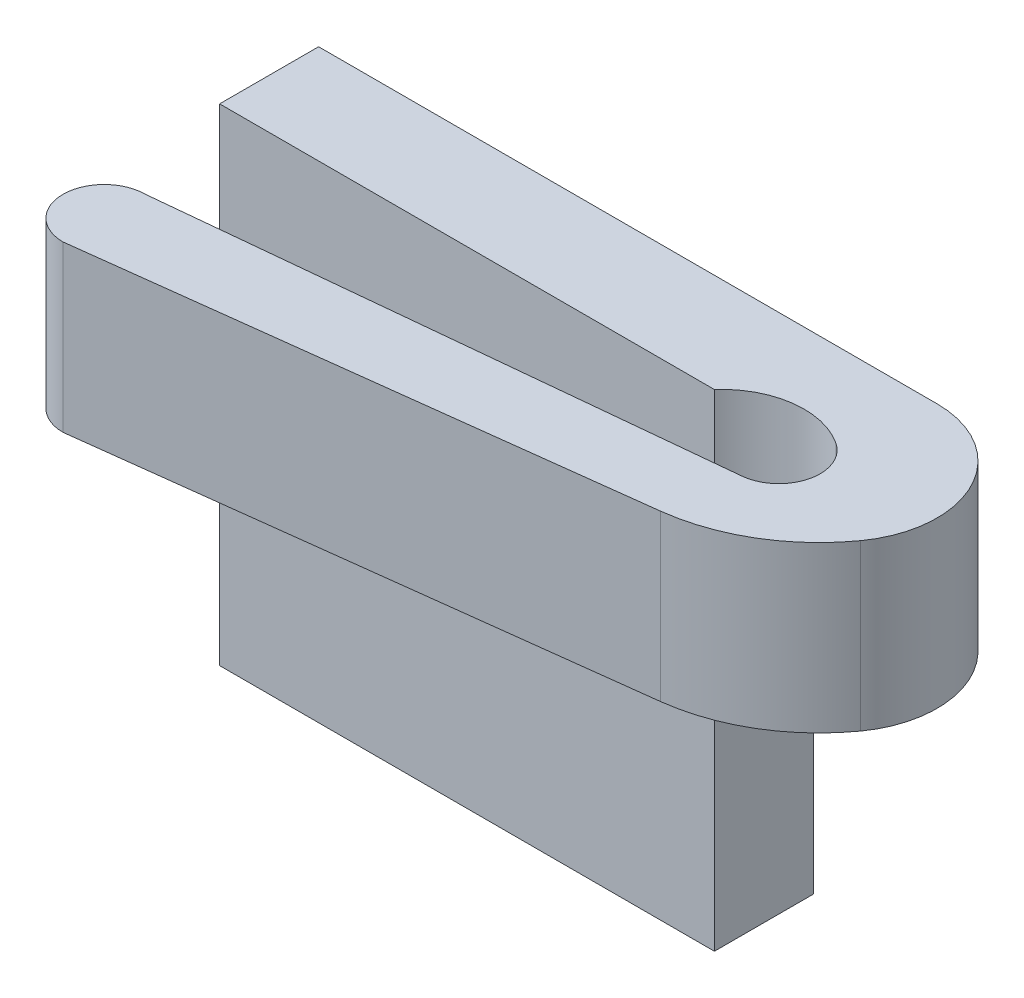
ISO-10303-21;
HEADER;
FILE_DESCRIPTION(('STEP AP214'),'2;1');
FILE_NAME('part.step','',(''),(''),'','','');
FILE_SCHEMA(('AUTOMOTIVE_DESIGN { 1 0 10303 214 1 1 1 1 }'));
ENDSEC;
DATA;
#1=APPLICATION_CONTEXT('core data for automotive mechanical design processes');
#2=APPLICATION_PROTOCOL_DEFINITION('international standard','automotive_design',2000,#1);
#3=PRODUCT_CONTEXT('',#1,'mechanical');
#4=PRODUCT('Part','Part','',(#3));
#5=PRODUCT_RELATED_PRODUCT_CATEGORY('part','',(#4));
#6=PRODUCT_DEFINITION_FORMATION('','',#4);
#7=PRODUCT_DEFINITION_CONTEXT('part definition',#1,'design');
#8=PRODUCT_DEFINITION('design','',#6,#7);
#9=PRODUCT_DEFINITION_SHAPE('','',#8);
#10=(LENGTH_UNIT() NAMED_UNIT(*) SI_UNIT(.MILLI.,.METRE.));
#11=(NAMED_UNIT(*) PLANE_ANGLE_UNIT() SI_UNIT($,.RADIAN.));
#12=(NAMED_UNIT(*) SI_UNIT($,.STERADIAN.) SOLID_ANGLE_UNIT());
#13=UNCERTAINTY_MEASURE_WITH_UNIT(LENGTH_MEASURE(1.E-05),#10,'distance_accuracy_value','');
#14=(GEOMETRIC_REPRESENTATION_CONTEXT(3) GLOBAL_UNCERTAINTY_ASSIGNED_CONTEXT((#13)) GLOBAL_UNIT_ASSIGNED_CONTEXT((#10,
#11,#12)) REPRESENTATION_CONTEXT('',''));
#15=CARTESIAN_POINT('',(0.,0.,0.));
#16=DIRECTION('',(0.,0.,1.));
#17=DIRECTION('',(1.,0.,0.));
#18=AXIS2_PLACEMENT_3D('',#15,#16,#17);
#19=CARTESIAN_POINT('',(6.75,0.,0.661437827766148));
#20=DIRECTION('',(0.,-1.,0.));
#21=DIRECTION('',(0.,0.,-1.));
#22=AXIS2_PLACEMENT_3D('',#19,#20,#21);
#23=PLANE('',#22);
#24=CARTESIAN_POINT('',(6.75,0.,0.661437827766148));
#25=DIRECTION('',(0.,-1.,0.));
#26=DIRECTION('',(0.,0.,-1.));
#27=AXIS2_PLACEMENT_3D('',#24,#25,#26);
#28=CIRCLE('',#27,1.);
#29=CARTESIAN_POINT('',(6.,0.,0.));
#30=VERTEX_POINT('',#29);
#31=CARTESIAN_POINT('',(7.30302361419959,0.,-0.171727751298196));
#32=VERTEX_POINT('',#31);
#33=EDGE_CURVE('E129',#30,#32,#28,.T.);
#34=ORIENTED_EDGE('',*,*,#33,.F.);
#35=DIRECTION('',(0.,0.,-1.));
#36=VECTOR('',#35,1.);
#37=CARTESIAN_POINT('',(6.,0.,0.));
#38=LINE('',#37,#36);
#39=CARTESIAN_POINT('',(6.,0.,-1.2));
#40=VERTEX_POINT('',#39);
#41=EDGE_CURVE('E125',#30,#40,#38,.T.);
#42=ORIENTED_EDGE('',*,*,#41,.T.);
#43=DIRECTION('',(-1.,0.,0.));
#44=VECTOR('',#43,1.);
#45=CARTESIAN_POINT('',(0.,0.,-1.2));
#46=LINE('',#45,#44);
#47=CARTESIAN_POINT('',(7.5,0.,-1.2));
#48=VERTEX_POINT('',#47);
#49=EDGE_CURVE('E156',#48,#40,#46,.T.);
#50=ORIENTED_EDGE('',*,*,#49,.F.);
#51=CARTESIAN_POINT('',(7.5,0.,0.));
#52=DIRECTION('',(0.,1.,0.));
#53=DIRECTION('',(0.,0.,-1.));
#54=AXIS2_PLACEMENT_3D('',#51,#52,#53);
#55=CIRCLE('',#54,1.2);
#56=CARTESIAN_POINT('',(8.4746794344809,0.,0.7));
#57=VERTEX_POINT('',#56);
#58=EDGE_CURVE('E182',#57,#48,#55,.T.);
#59=ORIENTED_EDGE('',*,*,#58,.F.);
#60=CARTESIAN_POINT('',(6.68045714652794,0.,-0.588583258387901));
#61=DIRECTION('',(0.,1.,0.));
#62=DIRECTION('',(0.,0.,-1.));
#63=AXIS2_PLACEMENT_3D('',#60,#61,#62);
#64=CIRCLE('',#63,2.20899987152212);
#65=CARTESIAN_POINT('',(6.9510491450663,0.,1.60378085432507));
#66=VERTEX_POINT('',#65);
#67=EDGE_CURVE('E180',#66,#57,#64,.T.);
#68=ORIENTED_EDGE('',*,*,#67,.F.);
#69=DIRECTION('',(0.99246909924097,0.,-0.122495253180758));
#70=VECTOR('',#69,1.);
#71=CARTESIAN_POINT('',(0.5,0.,2.4));
#72=LINE('',#71,#70);
#73=CARTESIAN_POINT('',(0.5,0.,2.4));
#74=VERTEX_POINT('',#73);
#75=EDGE_CURVE('E178',#74,#66,#72,.T.);
#76=ORIENTED_EDGE('',*,*,#75,.F.);
#77=CARTESIAN_POINT('',(0.5,0.,1.9));
#78=DIRECTION('',(0.,1.,0.));
#79=DIRECTION('',(0.,0.,1.));
#80=AXIS2_PLACEMENT_3D('',#77,#78,#79);
#81=CIRCLE('',#80,0.5);
#82=CARTESIAN_POINT('',(0.500000000000001,0.,1.4));
#83=VERTEX_POINT('',#82);
#84=EDGE_CURVE('E176',#83,#74,#81,.T.);
#85=ORIENTED_EDGE('',*,*,#84,.F.);
#86=DIRECTION('',(-0.995037190209989,0.,0.0995037190209989));
#87=VECTOR('',#86,1.);
#88=CARTESIAN_POINT('',(0.500000000000001,0.,1.4));
#89=LINE('',#88,#87);
#90=CARTESIAN_POINT('',(7.07626366661029,0.,0.742373633338971));
#91=VERTEX_POINT('',#90);
#92=EDGE_CURVE('E174',#91,#83,#89,.T.);
#93=ORIENTED_EDGE('',*,*,#92,.F.);
#94=CARTESIAN_POINT('',(7.02651180709979,0.,0.244855038233976));
#95=DIRECTION('',(0.,-1.,0.));
#96=DIRECTION('',(0.,0.,-1.));
#97=AXIS2_PLACEMENT_3D('',#94,#95,#96);
#98=CIRCLE('',#97,0.5);
#99=EDGE_CURVE('E41',#91,#32,#98,.F.);
#100=ORIENTED_EDGE('',*,*,#99,.T.);
#101=EDGE_LOOP('',(#34,#42,#50,#59,#68,#76,#85,#93,#100));
#102=FACE_BOUND('',#101,.T.);
#103=ADVANCED_FACE('F33',(#102),#23,.T.);
#104=CARTESIAN_POINT('',(0.,2.,-1.2));
#105=DIRECTION('',(1.,0.,0.));
#106=DIRECTION('',(0.,0.,-1.));
#107=AXIS2_PLACEMENT_3D('',#104,#105,#106);
#108=PLANE('',#107);
#109=DIRECTION('',(0.,-1.,0.));
#110=VECTOR('',#109,1.);
#111=CARTESIAN_POINT('',(0.,2.,-1.2));
#112=LINE('',#111,#110);
#113=CARTESIAN_POINT('',(0.,2.,-1.2));
#114=VERTEX_POINT('',#113);
#115=CARTESIAN_POINT('',(0.,-3.9,-1.2));
#116=VERTEX_POINT('',#115);
#117=EDGE_CURVE('E172',#114,#116,#112,.T.);
#118=ORIENTED_EDGE('',*,*,#117,.T.);
#119=DIRECTION('',(0.,0.,-1.));
#120=VECTOR('',#119,1.);
#121=CARTESIAN_POINT('',(0.,-3.9,0.));
#122=LINE('',#121,#120);
#123=CARTESIAN_POINT('',(0.,-3.9,0.));
#124=VERTEX_POINT('',#123);
#125=EDGE_CURVE('E140',#124,#116,#122,.T.);
#126=ORIENTED_EDGE('',*,*,#125,.F.);
#127=DIRECTION('',(0.,-1.,0.));
#128=VECTOR('',#127,1.);
#129=CARTESIAN_POINT('',(0.,2.,0.));
#130=LINE('',#129,#128);
#131=CARTESIAN_POINT('',(0.,2.,0.));
#132=VERTEX_POINT('',#131);
#133=EDGE_CURVE('E136',#132,#124,#130,.T.);
#134=ORIENTED_EDGE('',*,*,#133,.F.);
#135=DIRECTION('',(0.,0.,1.));
#136=VECTOR('',#135,1.);
#137=CARTESIAN_POINT('',(0.,2.,-1.2));
#138=LINE('',#137,#136);
#139=EDGE_CURVE('E152',#114,#132,#138,.T.);
#140=ORIENTED_EDGE('',*,*,#139,.F.);
#141=EDGE_LOOP('',(#118,#126,#134,#140));
#142=FACE_BOUND('',#141,.T.);
#143=ADVANCED_FACE('F236',(#142),#108,.F.);
#144=CARTESIAN_POINT('',(0.,2.,0.));
#145=DIRECTION('',(0.,0.,-1.));
#146=DIRECTION('',(-1.,0.,0.));
#147=AXIS2_PLACEMENT_3D('',#144,#145,#146);
#148=PLANE('',#147);
#149=ORIENTED_EDGE('',*,*,#133,.T.);
#150=DIRECTION('',(-1.,0.,0.));
#151=VECTOR('',#150,1.);
#152=CARTESIAN_POINT('',(0.,-3.9,0.));
#153=LINE('',#152,#151);
#154=CARTESIAN_POINT('',(6.,-3.9,0.));
#155=VERTEX_POINT('',#154);
#156=EDGE_CURVE('E133',#155,#124,#153,.T.);
#157=ORIENTED_EDGE('',*,*,#156,.F.);
#158=DIRECTION('',(0.,1.,0.));
#159=VECTOR('',#158,1.);
#160=CARTESIAN_POINT('',(6.,-3.9,0.));
#161=LINE('',#160,#159);
#162=EDGE_CURVE('E119',#155,#30,#161,.T.);
#163=ORIENTED_EDGE('',*,*,#162,.T.);
#164=DIRECTION('',(0.,-1.,0.));
#165=VECTOR('',#164,1.);
#166=CARTESIAN_POINT('',(6.,2.,0.));
#167=LINE('',#166,#165);
#168=CARTESIAN_POINT('',(6.,2.,0.));
#169=VERTEX_POINT('',#168);
#170=EDGE_CURVE('E202',#169,#30,#167,.T.);
#171=ORIENTED_EDGE('',*,*,#170,.F.);
#172=DIRECTION('',(1.,0.,0.));
#173=VECTOR('',#172,1.);
#174=CARTESIAN_POINT('',(0.,2.,0.));
#175=LINE('',#174,#173);
#176=EDGE_CURVE('E155',#132,#169,#175,.T.);
#177=ORIENTED_EDGE('',*,*,#176,.F.);
#178=EDGE_LOOP('',(#149,#157,#163,#171,#177));
#179=FACE_BOUND('',#178,.T.);
#180=ADVANCED_FACE('F134',(#179),#148,.F.);
#181=CARTESIAN_POINT('',(6.75,2.,0.661437827766148));
#182=DIRECTION('',(0.,-1.,0.));
#183=DIRECTION('',(0.,0.,-1.));
#184=AXIS2_PLACEMENT_3D('',#181,#182,#183);
#185=CYLINDRICAL_SURFACE('',#184,1.);
#186=ORIENTED_EDGE('',*,*,#33,.T.);
#187=DIRECTION('',(0.,-1.,0.));
#188=VECTOR('',#187,1.);
#189=CARTESIAN_POINT('',(7.30302361419959,2.,-0.171727751298196));
#190=LINE('',#189,#188);
#191=CARTESIAN_POINT('',(7.30302361419959,2.,-0.171727751298196));
#192=VERTEX_POINT('',#191);
#193=EDGE_CURVE('E48',#32,#192,#190,.F.);
#194=ORIENTED_EDGE('',*,*,#193,.T.);
#195=CARTESIAN_POINT('',(6.75,2.,0.661437827766148));
#196=DIRECTION('',(0.,-1.,0.));
#197=DIRECTION('',(0.,0.,-1.));
#198=AXIS2_PLACEMENT_3D('',#195,#196,#197);
#199=CIRCLE('',#198,1.);
#200=EDGE_CURVE('E158',#169,#192,#199,.T.);
#201=ORIENTED_EDGE('',*,*,#200,.F.);
#202=ORIENTED_EDGE('',*,*,#170,.T.);
#203=EDGE_LOOP('',(#186,#194,#201,#202));
#204=FACE_BOUND('',#203,.T.);
#205=ADVANCED_FACE('F263',(#204),#185,.F.);
#206=CARTESIAN_POINT('',(0.500000000000001,2.,1.4));
#207=DIRECTION('',(0.0995037190209989,0.,0.995037190209989));
#208=DIRECTION('',(0.995037190209989,0.,-0.0995037190209989));
#209=AXIS2_PLACEMENT_3D('',#206,#207,#208);
#210=PLANE('',#209);
#211=DIRECTION('',(-0.995037190209989,0.,0.0995037190209989));
#212=VECTOR('',#211,1.);
#213=CARTESIAN_POINT('',(0.500000000000001,2.,1.4));
#214=LINE('',#213,#212);
#215=CARTESIAN_POINT('',(7.07626366661029,2.,0.742373633338971));
#216=VERTEX_POINT('',#215);
#217=CARTESIAN_POINT('',(0.500000000000001,2.,1.4));
#218=VERTEX_POINT('',#217);
#219=EDGE_CURVE('E160',#216,#218,#214,.T.);
#220=ORIENTED_EDGE('',*,*,#219,.F.);
#221=DIRECTION('',(0.,1.,0.));
#222=VECTOR('',#221,1.);
#223=CARTESIAN_POINT('',(7.07626366661029,2.,0.74237363333897));
#224=LINE('',#223,#222);
#225=EDGE_CURVE('E205',#216,#91,#224,.F.);
#226=ORIENTED_EDGE('',*,*,#225,.T.);
#227=ORIENTED_EDGE('',*,*,#92,.T.);
#228=DIRECTION('',(0.,-1.,0.));
#229=VECTOR('',#228,1.);
#230=CARTESIAN_POINT('',(0.500000000000001,2.,1.4));
#231=LINE('',#230,#229);
#232=EDGE_CURVE('E199',#218,#83,#231,.T.);
#233=ORIENTED_EDGE('',*,*,#232,.F.);
#234=EDGE_LOOP('',(#220,#226,#227,#233));
#235=FACE_BOUND('',#234,.T.);
#236=ADVANCED_FACE('F211',(#235),#210,.F.);
#237=CARTESIAN_POINT('',(0.5,2.,1.9));
#238=DIRECTION('',(0.,-1.,0.));
#239=DIRECTION('',(0.,0.,-1.));
#240=AXIS2_PLACEMENT_3D('',#237,#238,#239);
#241=CYLINDRICAL_SURFACE('',#240,0.5);
#242=ORIENTED_EDGE('',*,*,#84,.T.);
#243=DIRECTION('',(0.,-1.,0.));
#244=VECTOR('',#243,1.);
#245=CARTESIAN_POINT('',(0.5,2.,2.4));
#246=LINE('',#245,#244);
#247=CARTESIAN_POINT('',(0.5,2.,2.4));
#248=VERTEX_POINT('',#247);
#249=EDGE_CURVE('E196',#248,#74,#246,.T.);
#250=ORIENTED_EDGE('',*,*,#249,.F.);
#251=CARTESIAN_POINT('',(0.5,2.,1.9));
#252=DIRECTION('',(0.,1.,0.));
#253=DIRECTION('',(0.,0.,1.));
#254=AXIS2_PLACEMENT_3D('',#251,#252,#253);
#255=CIRCLE('',#254,0.5);
#256=EDGE_CURVE('E162',#218,#248,#255,.T.);
#257=ORIENTED_EDGE('',*,*,#256,.F.);
#258=ORIENTED_EDGE('',*,*,#232,.T.);
#259=EDGE_LOOP('',(#242,#250,#257,#258));
#260=FACE_BOUND('',#259,.T.);
#261=ADVANCED_FACE('F220',(#260),#241,.T.);
#262=CARTESIAN_POINT('',(0.5,2.,2.4));
#263=DIRECTION('',(-0.122495253180758,0.,-0.99246909924097));
#264=DIRECTION('',(-0.99246909924097,0.,0.122495253180758));
#265=AXIS2_PLACEMENT_3D('',#262,#263,#264);
#266=PLANE('',#265);
#267=ORIENTED_EDGE('',*,*,#75,.T.);
#268=DIRECTION('',(0.,-1.,0.));
#269=VECTOR('',#268,1.);
#270=CARTESIAN_POINT('',(6.9510491450663,2.,1.60378085432507));
#271=LINE('',#270,#269);
#272=CARTESIAN_POINT('',(6.9510491450663,2.,1.60378085432507));
#273=VERTEX_POINT('',#272);
#274=EDGE_CURVE('E193',#273,#66,#271,.T.);
#275=ORIENTED_EDGE('',*,*,#274,.F.);
#276=DIRECTION('',(0.99246909924097,0.,-0.122495253180758));
#277=VECTOR('',#276,1.);
#278=CARTESIAN_POINT('',(0.5,2.,2.4));
#279=LINE('',#278,#277);
#280=EDGE_CURVE('E164',#248,#273,#279,.T.);
#281=ORIENTED_EDGE('',*,*,#280,.F.);
#282=ORIENTED_EDGE('',*,*,#249,.T.);
#283=EDGE_LOOP('',(#267,#275,#281,#282));
#284=FACE_BOUND('',#283,.T.);
#285=ADVANCED_FACE('F224',(#284),#266,.F.);
#286=CARTESIAN_POINT('',(6.68045714652794,2.,-0.588583258387901));
#287=DIRECTION('',(0.,-1.,0.));
#288=DIRECTION('',(0.,0.,-1.));
#289=AXIS2_PLACEMENT_3D('',#286,#287,#288);
#290=CYLINDRICAL_SURFACE('',#289,2.20899987152212);
#291=ORIENTED_EDGE('',*,*,#67,.T.);
#292=DIRECTION('',(0.,-1.,0.));
#293=VECTOR('',#292,1.);
#294=CARTESIAN_POINT('',(8.4746794344809,2.,0.7));
#295=LINE('',#294,#293);
#296=CARTESIAN_POINT('',(8.4746794344809,2.,0.7));
#297=VERTEX_POINT('',#296);
#298=EDGE_CURVE('E190',#297,#57,#295,.T.);
#299=ORIENTED_EDGE('',*,*,#298,.F.);
#300=CARTESIAN_POINT('',(6.68045714652794,2.,-0.588583258387901));
#301=DIRECTION('',(0.,1.,0.));
#302=DIRECTION('',(0.,0.,-1.));
#303=AXIS2_PLACEMENT_3D('',#300,#301,#302);
#304=CIRCLE('',#303,2.20899987152212);
#305=EDGE_CURVE('E166',#273,#297,#304,.T.);
#306=ORIENTED_EDGE('',*,*,#305,.F.);
#307=ORIENTED_EDGE('',*,*,#274,.T.);
#308=EDGE_LOOP('',(#291,#299,#306,#307));
#309=FACE_BOUND('',#308,.T.);
#310=ADVANCED_FACE('F252',(#309),#290,.T.);
#311=CARTESIAN_POINT('',(7.5,2.,0.));
#312=DIRECTION('',(0.,-1.,0.));
#313=DIRECTION('',(0.,0.,-1.));
#314=AXIS2_PLACEMENT_3D('',#311,#312,#313);
#315=CYLINDRICAL_SURFACE('',#314,1.2);
#316=ORIENTED_EDGE('',*,*,#58,.T.);
#317=DIRECTION('',(0.,-1.,0.));
#318=VECTOR('',#317,1.);
#319=CARTESIAN_POINT('',(7.5,2.,-1.2));
#320=LINE('',#319,#318);
#321=CARTESIAN_POINT('',(7.5,2.,-1.2));
#322=VERTEX_POINT('',#321);
#323=EDGE_CURVE('E187',#322,#48,#320,.T.);
#324=ORIENTED_EDGE('',*,*,#323,.F.);
#325=CARTESIAN_POINT('',(7.5,2.,0.));
#326=DIRECTION('',(0.,1.,0.));
#327=DIRECTION('',(0.,0.,-1.));
#328=AXIS2_PLACEMENT_3D('',#325,#326,#327);
#329=CIRCLE('',#328,1.2);
#330=EDGE_CURVE('E168',#297,#322,#329,.T.);
#331=ORIENTED_EDGE('',*,*,#330,.F.);
#332=ORIENTED_EDGE('',*,*,#298,.T.);
#333=EDGE_LOOP('',(#316,#324,#331,#332));
#334=FACE_BOUND('',#333,.T.);
#335=ADVANCED_FACE('F248',(#334),#315,.T.);
#336=CARTESIAN_POINT('',(0.,2.,-1.2));
#337=DIRECTION('',(0.,0.,1.));
#338=DIRECTION('',(1.,0.,0.));
#339=AXIS2_PLACEMENT_3D('',#336,#337,#338);
#340=PLANE('',#339);
#341=ORIENTED_EDGE('',*,*,#49,.T.);
#342=DIRECTION('',(0.,1.,0.));
#343=VECTOR('',#342,1.);
#344=CARTESIAN_POINT('',(6.,-3.9,-1.2));
#345=LINE('',#344,#343);
#346=CARTESIAN_POINT('',(6.,-3.9,-1.2));
#347=VERTEX_POINT('',#346);
#348=EDGE_CURVE('E130',#347,#40,#345,.T.);
#349=ORIENTED_EDGE('',*,*,#348,.F.);
#350=DIRECTION('',(1.,0.,0.));
#351=VECTOR('',#350,1.);
#352=CARTESIAN_POINT('',(0.,-3.9,-1.2));
#353=LINE('',#352,#351);
#354=EDGE_CURVE('E144',#116,#347,#353,.T.);
#355=ORIENTED_EDGE('',*,*,#354,.F.);
#356=ORIENTED_EDGE('',*,*,#117,.F.);
#357=DIRECTION('',(-1.,0.,0.));
#358=VECTOR('',#357,1.);
#359=CARTESIAN_POINT('',(0.,2.,-1.2));
#360=LINE('',#359,#358);
#361=EDGE_CURVE('E170',#322,#114,#360,.T.);
#362=ORIENTED_EDGE('',*,*,#361,.F.);
#363=ORIENTED_EDGE('',*,*,#323,.T.);
#364=EDGE_LOOP('',(#341,#349,#355,#356,#362,#363));
#365=FACE_BOUND('',#364,.T.);
#366=ADVANCED_FACE('F245',(#365),#340,.F.);
#367=CARTESIAN_POINT('',(6.75,2.,0.661437827766148));
#368=DIRECTION('',(0.,-1.,0.));
#369=DIRECTION('',(0.,0.,-1.));
#370=AXIS2_PLACEMENT_3D('',#367,#368,#369);
#371=PLANE('',#370);
#372=ORIENTED_EDGE('',*,*,#139,.T.);
#373=ORIENTED_EDGE('',*,*,#176,.T.);
#374=ORIENTED_EDGE('',*,*,#200,.T.);
#375=CARTESIAN_POINT('',(7.02651180709979,2.,0.244855038233976));
#376=DIRECTION('',(0.,-1.,0.));
#377=DIRECTION('',(0.,0.,-1.));
#378=AXIS2_PLACEMENT_3D('',#375,#376,#377);
#379=CIRCLE('',#378,0.5);
#380=EDGE_CURVE('E11',#192,#216,#379,.T.);
#381=ORIENTED_EDGE('',*,*,#380,.T.);
#382=ORIENTED_EDGE('',*,*,#219,.T.);
#383=ORIENTED_EDGE('',*,*,#256,.T.);
#384=ORIENTED_EDGE('',*,*,#280,.T.);
#385=ORIENTED_EDGE('',*,*,#305,.T.);
#386=ORIENTED_EDGE('',*,*,#330,.T.);
#387=ORIENTED_EDGE('',*,*,#361,.T.);
#388=EDGE_LOOP('',(#372,#373,#374,#381,#382,#383,#384,#385,#386,#387));
#389=FACE_BOUND('',#388,.T.);
#390=ADVANCED_FACE('F228',(#389),#371,.F.);
#391=CARTESIAN_POINT('',(6.,-3.9,0.));
#392=DIRECTION('',(1.,0.,0.));
#393=DIRECTION('',(0.,0.,-1.));
#394=AXIS2_PLACEMENT_3D('',#391,#392,#393);
#395=PLANE('',#394);
#396=ORIENTED_EDGE('',*,*,#41,.F.);
#397=ORIENTED_EDGE('',*,*,#162,.F.);
#398=DIRECTION('',(0.,0.,-1.));
#399=VECTOR('',#398,1.);
#400=CARTESIAN_POINT('',(6.,-3.9,0.));
#401=LINE('',#400,#399);
#402=EDGE_CURVE('E123',#155,#347,#401,.T.);
#403=ORIENTED_EDGE('',*,*,#402,.T.);
#404=ORIENTED_EDGE('',*,*,#348,.T.);
#405=EDGE_LOOP('',(#396,#397,#403,#404));
#406=FACE_BOUND('',#405,.T.);
#407=ADVANCED_FACE('F121',(#406),#395,.T.);
#408=CARTESIAN_POINT('',(0.,-3.9,0.));
#409=DIRECTION('',(0.,-1.,0.));
#410=DIRECTION('',(0.,0.,-1.));
#411=AXIS2_PLACEMENT_3D('',#408,#409,#410);
#412=PLANE('',#411);
#413=ORIENTED_EDGE('',*,*,#402,.F.);
#414=ORIENTED_EDGE('',*,*,#156,.T.);
#415=ORIENTED_EDGE('',*,*,#125,.T.);
#416=ORIENTED_EDGE('',*,*,#354,.T.);
#417=EDGE_LOOP('',(#413,#414,#415,#416));
#418=FACE_BOUND('',#417,.T.);
#419=ADVANCED_FACE('F142',(#418),#412,.T.);
#420=CARTESIAN_POINT('',(7.02651180709979,2.,0.244855038233976));
#421=DIRECTION('',(0.,-1.,0.));
#422=DIRECTION('',(0.,0.,-1.));
#423=AXIS2_PLACEMENT_3D('',#420,#421,#422);
#424=CYLINDRICAL_SURFACE('',#423,0.5);
#425=ORIENTED_EDGE('',*,*,#380,.F.);
#426=ORIENTED_EDGE('',*,*,#193,.F.);
#427=ORIENTED_EDGE('',*,*,#99,.F.);
#428=ORIENTED_EDGE('',*,*,#225,.F.);
#429=EDGE_LOOP('',(#425,#426,#427,#428));
#430=FACE_BOUND('',#429,.T.);
#431=ADVANCED_FACE('F35',(#430),#424,.F.);
#432=CLOSED_SHELL('',(#103,#143,#180,#205,#236,#261,#285,#310,#335,#366,#390,#407,#419,#431));
#433=MANIFOLD_SOLID_BREP('B2',#432);
#434=ADVANCED_BREP_SHAPE_REPRESENTATION('',(#18,#433),#14);
#435=SHAPE_DEFINITION_REPRESENTATION(#9,#434);
ENDSEC;
END-ISO-10303-21;
